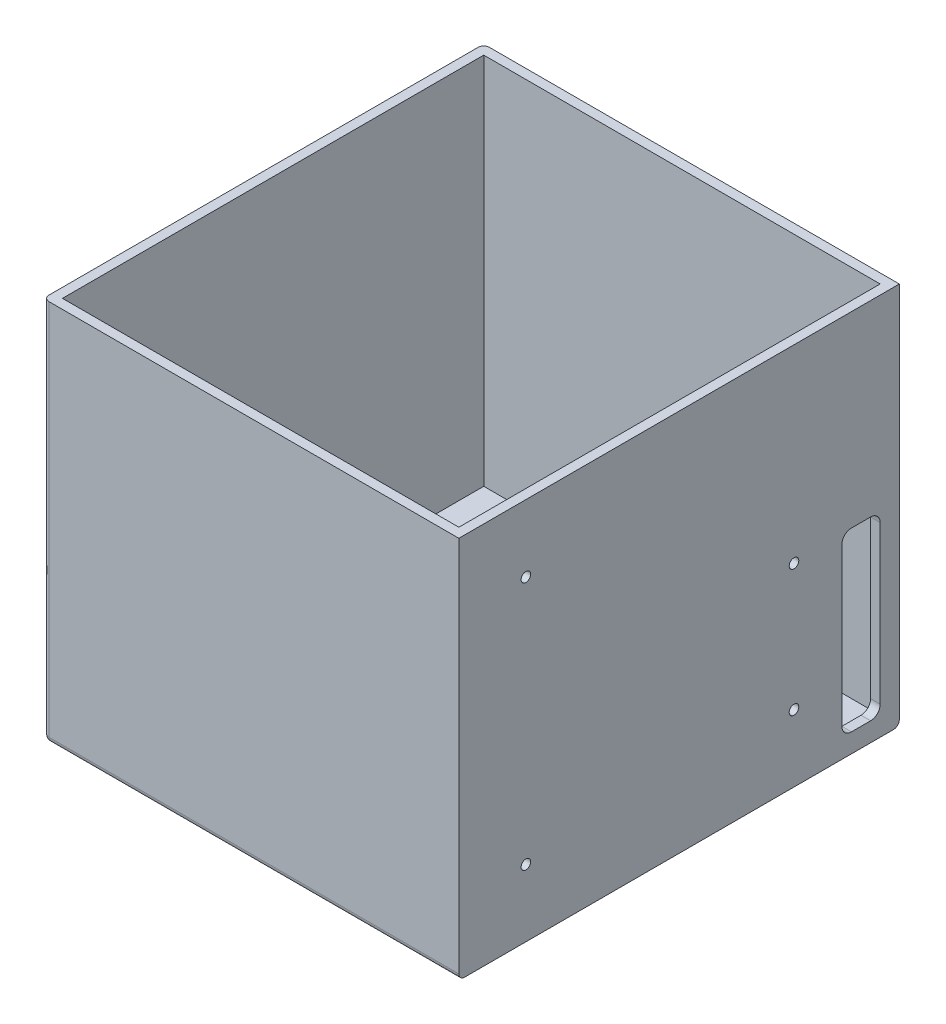
ISO-10303-21;
HEADER;
FILE_DESCRIPTION(('STEP AP214'),'2;1');
FILE_NAME('part.step','',(''),(''),'','','');
FILE_SCHEMA(('AUTOMOTIVE_DESIGN { 1 0 10303 214 1 1 1 1 }'));
ENDSEC;
DATA;
#1=APPLICATION_CONTEXT('core data for automotive mechanical design processes');
#2=APPLICATION_PROTOCOL_DEFINITION('international standard','automotive_design',2000,#1);
#3=PRODUCT_CONTEXT('',#1,'mechanical');
#4=PRODUCT('Part','Part','',(#3));
#5=PRODUCT_RELATED_PRODUCT_CATEGORY('part','',(#4));
#6=PRODUCT_DEFINITION_FORMATION('','',#4);
#7=PRODUCT_DEFINITION_CONTEXT('part definition',#1,'design');
#8=PRODUCT_DEFINITION('design','',#6,#7);
#9=PRODUCT_DEFINITION_SHAPE('','',#8);
#10=(LENGTH_UNIT() NAMED_UNIT(*) SI_UNIT(.MILLI.,.METRE.));
#11=(NAMED_UNIT(*) PLANE_ANGLE_UNIT() SI_UNIT($,.RADIAN.));
#12=(NAMED_UNIT(*) SI_UNIT($,.STERADIAN.) SOLID_ANGLE_UNIT());
#13=UNCERTAINTY_MEASURE_WITH_UNIT(LENGTH_MEASURE(1.E-05),#10,'distance_accuracy_value','');
#14=(GEOMETRIC_REPRESENTATION_CONTEXT(3) GLOBAL_UNCERTAINTY_ASSIGNED_CONTEXT((#13)) GLOBAL_UNIT_ASSIGNED_CONTEXT((#10,
#11,#12)) REPRESENTATION_CONTEXT('',''));
#15=CARTESIAN_POINT('',(0.,0.,0.));
#16=DIRECTION('',(0.,0.,1.));
#17=DIRECTION('',(1.,0.,0.));
#18=AXIS2_PLACEMENT_3D('',#15,#16,#17);
#19=CARTESIAN_POINT('',(117.297297297297,200.,-89.7324324324324));
#20=DIRECTION('',(-1.,0.,0.));
#21=DIRECTION('',(0.,0.,1.));
#22=AXIS2_PLACEMENT_3D('',#19,#20,#21);
#23=PLANE('',#22);
#24=DIRECTION('',(0.,-1.,0.));
#25=VECTOR('',#24,1.);
#26=CARTESIAN_POINT('',(117.297297297297,200.,140.267567567568));
#27=LINE('',#26,#25);
#28=CARTESIAN_POINT('',(117.297297297297,200.,140.267567567568));
#29=VERTEX_POINT('',#28);
#30=CARTESIAN_POINT('',(117.297297297297,3.,140.267567567568));
#31=VERTEX_POINT('',#30);
#32=EDGE_CURVE('E303',#29,#31,#27,.T.);
#33=ORIENTED_EDGE('',*,*,#32,.T.);
#34=CARTESIAN_POINT('',(117.297297297297,3.,137.267567567568));
#35=DIRECTION('',(-1.,0.,0.));
#36=DIRECTION('',(0.,0.,1.));
#37=AXIS2_PLACEMENT_3D('',#34,#35,#36);
#38=CIRCLE('',#37,3.);
#39=CARTESIAN_POINT('',(117.297297297297,0.,137.267567567568));
#40=VERTEX_POINT('',#39);
#41=EDGE_CURVE('E313',#31,#40,#38,.F.);
#42=ORIENTED_EDGE('',*,*,#41,.T.);
#43=DIRECTION('',(0.,0.,-1.));
#44=VECTOR('',#43,1.);
#45=CARTESIAN_POINT('',(117.297297297297,0.,-89.7324324324324));
#46=LINE('',#45,#44);
#47=CARTESIAN_POINT('',(117.297297297297,0.,-86.7324324324324));
#48=VERTEX_POINT('',#47);
#49=EDGE_CURVE('E281',#40,#48,#46,.T.);
#50=ORIENTED_EDGE('',*,*,#49,.T.);
#51=CARTESIAN_POINT('',(117.297297297297,3.,-86.7324324324324));
#52=DIRECTION('',(-1.,0.,0.));
#53=DIRECTION('',(0.,0.,1.));
#54=AXIS2_PLACEMENT_3D('',#51,#52,#53);
#55=CIRCLE('',#54,3.);
#56=CARTESIAN_POINT('',(117.297297297297,3.,-89.7324324324324));
#57=VERTEX_POINT('',#56);
#58=EDGE_CURVE('E311',#48,#57,#55,.F.);
#59=ORIENTED_EDGE('',*,*,#58,.T.);
#60=DIRECTION('',(0.,-1.,0.));
#61=VECTOR('',#60,1.);
#62=CARTESIAN_POINT('',(117.297297297297,200.,-89.7324324324324));
#63=LINE('',#62,#61);
#64=CARTESIAN_POINT('',(117.297297297297,200.,-89.7324324324324));
#65=VERTEX_POINT('',#64);
#66=EDGE_CURVE('E298',#65,#57,#63,.T.);
#67=ORIENTED_EDGE('',*,*,#66,.F.);
#68=DIRECTION('',(0.,0.,-1.));
#69=VECTOR('',#68,1.);
#70=CARTESIAN_POINT('',(117.297297297297,200.,-89.7324324324324));
#71=LINE('',#70,#69);
#72=EDGE_CURVE('E293',#29,#65,#71,.T.);
#73=ORIENTED_EDGE('',*,*,#72,.F.);
#74=EDGE_LOOP('',(#33,#42,#50,#59,#67,#73));
#75=FACE_BOUND('',#74,.T.);
#76=CARTESIAN_POINT('',(117.297297297297,35.,105.267567567568));
#77=DIRECTION('',(1.,0.,0.));
#78=DIRECTION('',(0.,0.,-1.));
#79=AXIS2_PLACEMENT_3D('',#76,#77,#78);
#80=CIRCLE('',#79,2.5);
#81=CARTESIAN_POINT('',(117.297297297297,35.,102.767567567568));
#82=VERTEX_POINT('',#81);
#83=EDGE_CURVE('E249',#82,#82,#80,.T.);
#84=ORIENTED_EDGE('',*,*,#83,.F.);
#85=EDGE_LOOP('',(#84));
#86=FACE_BOUND('',#85,.T.);
#87=CARTESIAN_POINT('',(117.297297297297,35.,-34.7324324324324));
#88=DIRECTION('',(1.,0.,0.));
#89=DIRECTION('',(0.,0.,-1.));
#90=AXIS2_PLACEMENT_3D('',#87,#88,#89);
#91=CIRCLE('',#90,2.5);
#92=CARTESIAN_POINT('',(117.297297297297,35.,-37.2324324324324));
#93=VERTEX_POINT('',#92);
#94=EDGE_CURVE('E243',#93,#93,#91,.T.);
#95=ORIENTED_EDGE('',*,*,#94,.F.);
#96=EDGE_LOOP('',(#95));
#97=FACE_BOUND('',#96,.T.);
#98=CARTESIAN_POINT('',(117.297297297297,101.184831324001,-34.7324324324324));
#99=DIRECTION('',(1.,0.,0.));
#100=DIRECTION('',(0.,0.,-1.));
#101=AXIS2_PLACEMENT_3D('',#98,#99,#100);
#102=CIRCLE('',#101,2.5);
#103=CARTESIAN_POINT('',(117.297297297297,101.184831324001,-37.2324324324324));
#104=VERTEX_POINT('',#103);
#105=EDGE_CURVE('E237',#104,#104,#102,.T.);
#106=ORIENTED_EDGE('',*,*,#105,.F.);
#107=EDGE_LOOP('',(#106));
#108=FACE_BOUND('',#107,.T.);
#109=CARTESIAN_POINT('',(117.297297297297,165.,105.267567567568));
#110=DIRECTION('',(1.,0.,0.));
#111=DIRECTION('',(0.,0.,-1.));
#112=AXIS2_PLACEMENT_3D('',#109,#110,#111);
#113=CIRCLE('',#112,2.5);
#114=CARTESIAN_POINT('',(117.297297297297,165.,102.767567567568));
#115=VERTEX_POINT('',#114);
#116=EDGE_CURVE('E234',#115,#115,#113,.T.);
#117=ORIENTED_EDGE('',*,*,#116,.F.);
#118=EDGE_LOOP('',(#117));
#119=FACE_BOUND('',#118,.T.);
#120=DIRECTION('',(0.,0.,-1.));
#121=VECTOR('',#120,1.);
#122=CARTESIAN_POINT('',(117.297297297297,102.133518404401,0.));
#123=LINE('',#122,#121);
#124=CARTESIAN_POINT('',(117.297297297297,102.133518404401,-64.7324324324325));
#125=VERTEX_POINT('',#124);
#126=CARTESIAN_POINT('',(117.297297297297,102.133518404401,-74.7324324324324));
#127=VERTEX_POINT('',#126);
#128=EDGE_CURVE('E61',#125,#127,#123,.T.);
#129=ORIENTED_EDGE('',*,*,#128,.T.);
#130=CARTESIAN_POINT('',(117.297297297297,97.1335184044014,-74.7324324324324));
#131=DIRECTION('',(1.,0.,0.));
#132=DIRECTION('',(0.,0.,-1.));
#133=AXIS2_PLACEMENT_3D('',#130,#131,#132);
#134=CIRCLE('',#133,5.);
#135=CARTESIAN_POINT('',(117.297297297297,97.1335184044014,-79.7324324324324));
#136=VERTEX_POINT('',#135);
#137=EDGE_CURVE('E214',#127,#136,#134,.F.);
#138=ORIENTED_EDGE('',*,*,#137,.T.);
#139=DIRECTION('',(0.,-1.,0.));
#140=VECTOR('',#139,1.);
#141=CARTESIAN_POINT('',(117.297297297297,0.,-79.7324324324324));
#142=LINE('',#141,#140);
#143=CARTESIAN_POINT('',(117.297297297297,14.966834817308,-79.7324324324324));
#144=VERTEX_POINT('',#143);
#145=EDGE_CURVE('E211',#136,#144,#142,.T.);
#146=ORIENTED_EDGE('',*,*,#145,.T.);
#147=CARTESIAN_POINT('',(117.297297297297,14.966834817308,-74.7324324324324));
#148=DIRECTION('',(1.,0.,0.));
#149=DIRECTION('',(0.,0.,-1.));
#150=AXIS2_PLACEMENT_3D('',#147,#148,#149);
#151=CIRCLE('',#150,4.99999999999999);
#152=CARTESIAN_POINT('',(117.297297297297,9.96683481730805,-74.7324324324324));
#153=VERTEX_POINT('',#152);
#154=EDGE_CURVE('E208',#153,#144,#151,.T.);
#155=ORIENTED_EDGE('',*,*,#154,.F.);
#156=DIRECTION('',(0.,0.,-1.));
#157=VECTOR('',#156,1.);
#158=CARTESIAN_POINT('',(117.297297297297,9.96683481730805,0.));
#159=LINE('',#158,#157);
#160=CARTESIAN_POINT('',(117.297297297297,9.96683481730805,-64.7324324324325));
#161=VERTEX_POINT('',#160);
#162=EDGE_CURVE('E202',#161,#153,#159,.T.);
#163=ORIENTED_EDGE('',*,*,#162,.F.);
#164=CARTESIAN_POINT('',(117.297297297297,14.966834817308,-64.7324324324325));
#165=DIRECTION('',(1.,0.,0.));
#166=DIRECTION('',(0.,0.,-1.));
#167=AXIS2_PLACEMENT_3D('',#164,#165,#166);
#168=CIRCLE('',#167,5.00000000000001);
#169=CARTESIAN_POINT('',(117.297297297297,14.966834817308,-59.7324324324325));
#170=VERTEX_POINT('',#169);
#171=EDGE_CURVE('E200',#170,#161,#168,.T.);
#172=ORIENTED_EDGE('',*,*,#171,.F.);
#173=DIRECTION('',(0.,-1.,0.));
#174=VECTOR('',#173,1.);
#175=CARTESIAN_POINT('',(117.297297297297,0.,-59.7324324324325));
#176=LINE('',#175,#174);
#177=CARTESIAN_POINT('',(117.297297297297,97.1335184044014,-59.7324324324325));
#178=VERTEX_POINT('',#177);
#179=EDGE_CURVE('E185',#178,#170,#176,.T.);
#180=ORIENTED_EDGE('',*,*,#179,.F.);
#181=CARTESIAN_POINT('',(117.297297297297,97.1335184044014,-64.7324324324325));
#182=DIRECTION('',(1.,0.,0.));
#183=DIRECTION('',(0.,0.,-1.));
#184=AXIS2_PLACEMENT_3D('',#181,#182,#183);
#185=CIRCLE('',#184,5.);
#186=EDGE_CURVE('E194',#125,#178,#185,.T.);
#187=ORIENTED_EDGE('',*,*,#186,.F.);
#188=EDGE_LOOP('',(#129,#138,#146,#155,#163,#172,#180,#187));
#189=FACE_BOUND('',#188,.T.);
#190=ADVANCED_FACE('F46',(#75,#86,#97,#108,#119,#189),#23,.F.);
#191=CARTESIAN_POINT('',(112.297297297297,5.,135.267567567568));
#192=DIRECTION('',(1.,0.,0.));
#193=DIRECTION('',(0.,0.,-1.));
#194=AXIS2_PLACEMENT_3D('',#191,#192,#193);
#195=PLANE('',#194);
#196=DIRECTION('',(0.,0.,-1.));
#197=VECTOR('',#196,1.);
#198=CARTESIAN_POINT('',(112.297297297297,200.,135.267567567568));
#199=LINE('',#198,#197);
#200=CARTESIAN_POINT('',(112.297297297297,200.,135.267567567568));
#201=VERTEX_POINT('',#200);
#202=CARTESIAN_POINT('',(112.297297297297,200.,-84.7324324324324));
#203=VERTEX_POINT('',#202);
#204=EDGE_CURVE('E258',#201,#203,#199,.T.);
#205=ORIENTED_EDGE('',*,*,#204,.T.);
#206=DIRECTION('',(0.,1.,0.));
#207=VECTOR('',#206,1.);
#208=CARTESIAN_POINT('',(112.297297297297,5.,-84.7324324324324));
#209=LINE('',#208,#207);
#210=CARTESIAN_POINT('',(112.297297297297,5.,-84.7324324324324));
#211=VERTEX_POINT('',#210);
#212=EDGE_CURVE('E279',#211,#203,#209,.T.);
#213=ORIENTED_EDGE('',*,*,#212,.F.);
#214=DIRECTION('',(0.,0.,-1.));
#215=VECTOR('',#214,1.);
#216=CARTESIAN_POINT('',(112.297297297297,5.,135.267567567568));
#217=LINE('',#216,#215);
#218=CARTESIAN_POINT('',(112.297297297297,5.,135.267567567568));
#219=VERTEX_POINT('',#218);
#220=EDGE_CURVE('E264',#219,#211,#217,.T.);
#221=ORIENTED_EDGE('',*,*,#220,.F.);
#222=DIRECTION('',(0.,1.,0.));
#223=VECTOR('',#222,1.);
#224=CARTESIAN_POINT('',(112.297297297297,5.,135.267567567568));
#225=LINE('',#224,#223);
#226=EDGE_CURVE('E282',#219,#201,#225,.T.);
#227=ORIENTED_EDGE('',*,*,#226,.T.);
#228=EDGE_LOOP('',(#205,#213,#221,#227));
#229=FACE_BOUND('',#228,.T.);
#230=CARTESIAN_POINT('',(112.297297297297,35.,105.267567567568));
#231=DIRECTION('',(1.,0.,0.));
#232=DIRECTION('',(0.,0.,-1.));
#233=AXIS2_PLACEMENT_3D('',#230,#231,#232);
#234=CIRCLE('',#233,2.5);
#235=CARTESIAN_POINT('',(112.297297297297,35.,102.767567567568));
#236=VERTEX_POINT('',#235);
#237=EDGE_CURVE('E219',#236,#236,#234,.T.);
#238=ORIENTED_EDGE('',*,*,#237,.T.);
#239=EDGE_LOOP('',(#238));
#240=FACE_BOUND('',#239,.T.);
#241=CARTESIAN_POINT('',(112.297297297297,35.,-34.7324324324324));
#242=DIRECTION('',(1.,0.,0.));
#243=DIRECTION('',(0.,0.,-1.));
#244=AXIS2_PLACEMENT_3D('',#241,#242,#243);
#245=CIRCLE('',#244,2.5);
#246=CARTESIAN_POINT('',(112.297297297297,35.,-37.2324324324324));
#247=VERTEX_POINT('',#246);
#248=EDGE_CURVE('E246',#247,#247,#245,.T.);
#249=ORIENTED_EDGE('',*,*,#248,.T.);
#250=EDGE_LOOP('',(#249));
#251=FACE_BOUND('',#250,.T.);
#252=CARTESIAN_POINT('',(112.297297297297,101.184831324001,-34.7324324324324));
#253=DIRECTION('',(1.,0.,0.));
#254=DIRECTION('',(0.,0.,-1.));
#255=AXIS2_PLACEMENT_3D('',#252,#253,#254);
#256=CIRCLE('',#255,2.5);
#257=CARTESIAN_POINT('',(112.297297297297,101.184831324001,-37.2324324324324));
#258=VERTEX_POINT('',#257);
#259=EDGE_CURVE('E240',#258,#258,#256,.T.);
#260=ORIENTED_EDGE('',*,*,#259,.T.);
#261=EDGE_LOOP('',(#260));
#262=FACE_BOUND('',#261,.T.);
#263=CARTESIAN_POINT('',(112.297297297297,165.,105.267567567568));
#264=DIRECTION('',(1.,0.,0.));
#265=DIRECTION('',(0.,0.,-1.));
#266=AXIS2_PLACEMENT_3D('',#263,#264,#265);
#267=CIRCLE('',#266,2.5);
#268=CARTESIAN_POINT('',(112.297297297297,165.,102.767567567568));
#269=VERTEX_POINT('',#268);
#270=EDGE_CURVE('E230',#269,#269,#267,.T.);
#271=ORIENTED_EDGE('',*,*,#270,.T.);
#272=EDGE_LOOP('',(#271));
#273=FACE_BOUND('',#272,.T.);
#274=DIRECTION('',(0.,0.,-1.));
#275=VECTOR('',#274,1.);
#276=CARTESIAN_POINT('',(112.297297297297,102.133518404401,135.267567567568));
#277=LINE('',#276,#275);
#278=CARTESIAN_POINT('',(112.297297297297,102.133518404401,-64.7324324324325));
#279=VERTEX_POINT('',#278);
#280=CARTESIAN_POINT('',(112.297297297297,102.133518404401,-74.7324324324324));
#281=VERTEX_POINT('',#280);
#282=EDGE_CURVE('E12',#279,#281,#277,.T.);
#283=ORIENTED_EDGE('',*,*,#282,.F.);
#284=CARTESIAN_POINT('',(112.297297297297,97.1335184044014,-64.7324324324325));
#285=DIRECTION('',(1.,0.,0.));
#286=DIRECTION('',(0.,0.,-1.));
#287=AXIS2_PLACEMENT_3D('',#284,#285,#286);
#288=CIRCLE('',#287,5.);
#289=CARTESIAN_POINT('',(112.297297297297,97.1335184044014,-59.7324324324325));
#290=VERTEX_POINT('',#289);
#291=EDGE_CURVE('E335',#279,#290,#288,.T.);
#292=ORIENTED_EDGE('',*,*,#291,.T.);
#293=DIRECTION('',(0.,-1.,0.));
#294=VECTOR('',#293,1.);
#295=CARTESIAN_POINT('',(112.297297297297,5.,-59.7324324324325));
#296=LINE('',#295,#294);
#297=CARTESIAN_POINT('',(112.297297297297,14.966834817308,-59.7324324324325));
#298=VERTEX_POINT('',#297);
#299=EDGE_CURVE('E188',#290,#298,#296,.T.);
#300=ORIENTED_EDGE('',*,*,#299,.T.);
#301=CARTESIAN_POINT('',(112.297297297297,14.966834817308,-64.7324324324325));
#302=DIRECTION('',(1.,0.,0.));
#303=DIRECTION('',(0.,0.,-1.));
#304=AXIS2_PLACEMENT_3D('',#301,#302,#303);
#305=CIRCLE('',#304,5.00000000000001);
#306=CARTESIAN_POINT('',(112.297297297297,9.96683481730805,-64.7324324324325));
#307=VERTEX_POINT('',#306);
#308=EDGE_CURVE('E354',#298,#307,#305,.T.);
#309=ORIENTED_EDGE('',*,*,#308,.T.);
#310=DIRECTION('',(0.,0.,-1.));
#311=VECTOR('',#310,1.);
#312=CARTESIAN_POINT('',(112.297297297297,9.96683481730805,135.267567567568));
#313=LINE('',#312,#311);
#314=CARTESIAN_POINT('',(112.297297297297,9.96683481730805,-74.7324324324324));
#315=VERTEX_POINT('',#314);
#316=EDGE_CURVE('E357',#307,#315,#313,.T.);
#317=ORIENTED_EDGE('',*,*,#316,.T.);
#318=CARTESIAN_POINT('',(112.297297297297,14.966834817308,-74.7324324324324));
#319=DIRECTION('',(1.,0.,0.));
#320=DIRECTION('',(0.,0.,-1.));
#321=AXIS2_PLACEMENT_3D('',#318,#319,#320);
#322=CIRCLE('',#321,4.99999999999999);
#323=CARTESIAN_POINT('',(112.297297297297,14.966834817308,-79.7324324324324));
#324=VERTEX_POINT('',#323);
#325=EDGE_CURVE('E360',#315,#324,#322,.T.);
#326=ORIENTED_EDGE('',*,*,#325,.T.);
#327=DIRECTION('',(0.,-1.,0.));
#328=VECTOR('',#327,1.);
#329=CARTESIAN_POINT('',(112.297297297297,5.,-79.7324324324324));
#330=LINE('',#329,#328);
#331=CARTESIAN_POINT('',(112.297297297297,97.1335184044014,-79.7324324324324));
#332=VERTEX_POINT('',#331);
#333=EDGE_CURVE('E363',#332,#324,#330,.T.);
#334=ORIENTED_EDGE('',*,*,#333,.F.);
#335=CARTESIAN_POINT('',(112.297297297297,97.1335184044014,-74.7324324324324));
#336=DIRECTION('',(1.,0.,0.));
#337=DIRECTION('',(0.,0.,-1.));
#338=AXIS2_PLACEMENT_3D('',#335,#336,#337);
#339=CIRCLE('',#338,5.);
#340=EDGE_CURVE('E54',#281,#332,#339,.F.);
#341=ORIENTED_EDGE('',*,*,#340,.F.);
#342=EDGE_LOOP('',(#283,#292,#300,#309,#317,#326,#334,#341));
#343=FACE_BOUND('',#342,.T.);
#344=ADVANCED_FACE('F377',(#229,#240,#251,#262,#273,#343),#195,.F.);
#345=CARTESIAN_POINT('',(-99.7027027027027,200.,-89.7324324324324));
#346=DIRECTION('',(1.,0.,0.));
#347=DIRECTION('',(0.,0.,-1.));
#348=AXIS2_PLACEMENT_3D('',#345,#346,#347);
#349=PLANE('',#348);
#350=DIRECTION('',(0.,0.,1.));
#351=VECTOR('',#350,1.);
#352=CARTESIAN_POINT('',(-99.7027027027027,3.,-89.7324324324324));
#353=LINE('',#352,#351);
#354=CARTESIAN_POINT('',(-99.7027027027027,3.,-86.7324324324324));
#355=VERTEX_POINT('',#354);
#356=CARTESIAN_POINT('',(-99.7027027027026,3.,137.267567567568));
#357=VERTEX_POINT('',#356);
#358=EDGE_CURVE('E327',#355,#357,#353,.T.);
#359=ORIENTED_EDGE('',*,*,#358,.T.);
#360=DIRECTION('',(0.,-1.,0.));
#361=VECTOR('',#360,1.);
#362=CARTESIAN_POINT('',(-99.7027027027026,200.,137.267567567568));
#363=LINE('',#362,#361);
#364=CARTESIAN_POINT('',(-99.7027027027026,200.,137.267567567568));
#365=VERTEX_POINT('',#364);
#366=EDGE_CURVE('E329',#357,#365,#363,.F.);
#367=ORIENTED_EDGE('',*,*,#366,.T.);
#368=DIRECTION('',(0.,0.,1.));
#369=VECTOR('',#368,1.);
#370=CARTESIAN_POINT('',(-99.7027027027027,200.,-89.7324324324324));
#371=LINE('',#370,#369);
#372=CARTESIAN_POINT('',(-99.7027027027027,200.,-86.7324324324324));
#373=VERTEX_POINT('',#372);
#374=EDGE_CURVE('E288',#373,#365,#371,.T.);
#375=ORIENTED_EDGE('',*,*,#374,.F.);
#376=DIRECTION('',(0.,-1.,0.));
#377=VECTOR('',#376,1.);
#378=CARTESIAN_POINT('',(-99.7027027027027,200.,-86.7324324324324));
#379=LINE('',#378,#377);
#380=EDGE_CURVE('E325',#373,#355,#379,.T.);
#381=ORIENTED_EDGE('',*,*,#380,.T.);
#382=EDGE_LOOP('',(#359,#367,#375,#381));
#383=FACE_BOUND('',#382,.T.);
#384=ADVANCED_FACE('F408',(#383),#349,.F.);
#385=CARTESIAN_POINT('',(-99.7027027027026,200.,140.267567567568));
#386=DIRECTION('',(0.,0.,-1.));
#387=DIRECTION('',(-1.,0.,0.));
#388=AXIS2_PLACEMENT_3D('',#385,#386,#387);
#389=PLANE('',#388);
#390=DIRECTION('',(0.,-1.,0.));
#391=VECTOR('',#390,1.);
#392=CARTESIAN_POINT('',(-96.7027027027026,200.,140.267567567568));
#393=LINE('',#392,#391);
#394=CARTESIAN_POINT('',(-96.7027027027026,200.,140.267567567568));
#395=VERTEX_POINT('',#394);
#396=CARTESIAN_POINT('',(-96.7027027027026,3.,140.267567567568));
#397=VERTEX_POINT('',#396);
#398=EDGE_CURVE('E306',#395,#397,#393,.T.);
#399=ORIENTED_EDGE('',*,*,#398,.T.);
#400=DIRECTION('',(1.,0.,0.));
#401=VECTOR('',#400,1.);
#402=CARTESIAN_POINT('',(-99.7027027027026,3.,140.267567567568));
#403=LINE('',#402,#401);
#404=EDGE_CURVE('E308',#397,#31,#403,.T.);
#405=ORIENTED_EDGE('',*,*,#404,.T.);
#406=ORIENTED_EDGE('',*,*,#32,.F.);
#407=DIRECTION('',(1.,0.,0.));
#408=VECTOR('',#407,1.);
#409=CARTESIAN_POINT('',(-99.7027027027026,200.,140.267567567568));
#410=LINE('',#409,#408);
#411=EDGE_CURVE('E291',#395,#29,#410,.T.);
#412=ORIENTED_EDGE('',*,*,#411,.F.);
#413=EDGE_LOOP('',(#399,#405,#406,#412));
#414=FACE_BOUND('',#413,.T.);
#415=ADVANCED_FACE('F416',(#414),#389,.F.);
#416=CARTESIAN_POINT('',(-99.7027027027027,200.,-89.7324324324324));
#417=DIRECTION('',(0.,0.,1.));
#418=DIRECTION('',(1.,0.,0.));
#419=AXIS2_PLACEMENT_3D('',#416,#417,#418);
#420=PLANE('',#419);
#421=ORIENTED_EDGE('',*,*,#66,.T.);
#422=DIRECTION('',(-1.,0.,0.));
#423=VECTOR('',#422,1.);
#424=CARTESIAN_POINT('',(-99.7027027027027,3.,-89.7324324324324));
#425=LINE('',#424,#423);
#426=CARTESIAN_POINT('',(-96.7027027027027,3.,-89.7324324324324));
#427=VERTEX_POINT('',#426);
#428=EDGE_CURVE('E323',#57,#427,#425,.T.);
#429=ORIENTED_EDGE('',*,*,#428,.T.);
#430=DIRECTION('',(0.,-1.,0.));
#431=VECTOR('',#430,1.);
#432=CARTESIAN_POINT('',(-96.7027027027027,200.,-89.7324324324324));
#433=LINE('',#432,#431);
#434=CARTESIAN_POINT('',(-96.7027027027027,200.,-89.7324324324324));
#435=VERTEX_POINT('',#434);
#436=EDGE_CURVE('E321',#427,#435,#433,.F.);
#437=ORIENTED_EDGE('',*,*,#436,.T.);
#438=DIRECTION('',(-1.,0.,0.));
#439=VECTOR('',#438,1.);
#440=CARTESIAN_POINT('',(-99.7027027027027,200.,-89.7324324324324));
#441=LINE('',#440,#439);
#442=EDGE_CURVE('E295',#65,#435,#441,.T.);
#443=ORIENTED_EDGE('',*,*,#442,.F.);
#444=EDGE_LOOP('',(#421,#429,#437,#443));
#445=FACE_BOUND('',#444,.T.);
#446=ADVANCED_FACE('F414',(#445),#420,.F.);
#447=CARTESIAN_POINT('',(0.,200.,0.));
#448=DIRECTION('',(0.,1.,0.));
#449=DIRECTION('',(0.,0.,1.));
#450=AXIS2_PLACEMENT_3D('',#447,#448,#449);
#451=PLANE('',#450);
#452=DIRECTION('',(-1.,0.,0.));
#453=VECTOR('',#452,1.);
#454=CARTESIAN_POINT('',(112.297297297297,200.,-84.7324324324324));
#455=LINE('',#454,#453);
#456=CARTESIAN_POINT('',(-94.7027027027027,200.,-84.7324324324324));
#457=VERTEX_POINT('',#456);
#458=EDGE_CURVE('E268',#203,#457,#455,.T.);
#459=ORIENTED_EDGE('',*,*,#458,.F.);
#460=ORIENTED_EDGE('',*,*,#204,.F.);
#461=DIRECTION('',(1.,0.,0.));
#462=VECTOR('',#461,1.);
#463=CARTESIAN_POINT('',(-94.7027027027026,200.,135.267567567568));
#464=LINE('',#463,#462);
#465=CARTESIAN_POINT('',(-94.7027027027026,200.,135.267567567568));
#466=VERTEX_POINT('',#465);
#467=EDGE_CURVE('E274',#466,#201,#464,.T.);
#468=ORIENTED_EDGE('',*,*,#467,.F.);
#469=DIRECTION('',(0.,0.,1.));
#470=VECTOR('',#469,1.);
#471=CARTESIAN_POINT('',(-94.7027027027027,200.,-84.7324324324324));
#472=LINE('',#471,#470);
#473=EDGE_CURVE('E270',#457,#466,#472,.T.);
#474=ORIENTED_EDGE('',*,*,#473,.F.);
#475=EDGE_LOOP('',(#459,#460,#468,#474));
#476=FACE_BOUND('',#475,.T.);
#477=ORIENTED_EDGE('',*,*,#374,.T.);
#478=CARTESIAN_POINT('',(-96.7027027027026,200.,137.267567567568));
#479=DIRECTION('',(0.,1.,0.));
#480=DIRECTION('',(0.,0.,1.));
#481=AXIS2_PLACEMENT_3D('',#478,#479,#480);
#482=CIRCLE('',#481,3.);
#483=EDGE_CURVE('E333',#365,#395,#482,.T.);
#484=ORIENTED_EDGE('',*,*,#483,.T.);
#485=ORIENTED_EDGE('',*,*,#411,.T.);
#486=ORIENTED_EDGE('',*,*,#72,.T.);
#487=ORIENTED_EDGE('',*,*,#442,.T.);
#488=CARTESIAN_POINT('',(-96.7027027027027,200.,-86.7324324324324));
#489=DIRECTION('',(0.,1.,0.));
#490=DIRECTION('',(0.,0.,1.));
#491=AXIS2_PLACEMENT_3D('',#488,#489,#490);
#492=CIRCLE('',#491,3.);
#493=EDGE_CURVE('E331',#435,#373,#492,.T.);
#494=ORIENTED_EDGE('',*,*,#493,.T.);
#495=EDGE_LOOP('',(#477,#484,#485,#486,#487,#494));
#496=FACE_BOUND('',#495,.T.);
#497=ADVANCED_FACE('F458',(#476,#496),#451,.T.);
#498=CARTESIAN_POINT('',(0.,0.,0.));
#499=DIRECTION('',(0.,1.,0.));
#500=DIRECTION('',(0.,0.,1.));
#501=AXIS2_PLACEMENT_3D('',#498,#499,#500);
#502=PLANE('',#501);
#503=ORIENTED_EDGE('',*,*,#49,.F.);
#504=DIRECTION('',(1.,0.,0.));
#505=VECTOR('',#504,1.);
#506=CARTESIAN_POINT('',(0.,0.,137.267567567568));
#507=LINE('',#506,#505);
#508=CARTESIAN_POINT('',(-96.7027027027026,0.,137.267567567568));
#509=VERTEX_POINT('',#508);
#510=EDGE_CURVE('E319',#40,#509,#507,.F.);
#511=ORIENTED_EDGE('',*,*,#510,.T.);
#512=DIRECTION('',(0.,0.,1.));
#513=VECTOR('',#512,1.);
#514=CARTESIAN_POINT('',(-96.7027027027026,0.,0.));
#515=LINE('',#514,#513);
#516=CARTESIAN_POINT('',(-96.7027027027027,0.,-86.7324324324324));
#517=VERTEX_POINT('',#516);
#518=EDGE_CURVE('E315',#509,#517,#515,.F.);
#519=ORIENTED_EDGE('',*,*,#518,.T.);
#520=DIRECTION('',(-1.,0.,0.));
#521=VECTOR('',#520,1.);
#522=CARTESIAN_POINT('',(0.,0.,-86.7324324324324));
#523=LINE('',#522,#521);
#524=EDGE_CURVE('E317',#517,#48,#523,.F.);
#525=ORIENTED_EDGE('',*,*,#524,.T.);
#526=EDGE_LOOP('',(#503,#511,#519,#525));
#527=FACE_BOUND('',#526,.T.);
#528=ADVANCED_FACE('F481',(#527),#502,.F.);
#529=CARTESIAN_POINT('',(112.297297297297,5.,-84.7324324324324));
#530=DIRECTION('',(0.,0.,-1.));
#531=DIRECTION('',(-1.,0.,0.));
#532=AXIS2_PLACEMENT_3D('',#529,#530,#531);
#533=PLANE('',#532);
#534=ORIENTED_EDGE('',*,*,#458,.T.);
#535=DIRECTION('',(0.,1.,0.));
#536=VECTOR('',#535,1.);
#537=CARTESIAN_POINT('',(-94.7027027027027,5.,-84.7324324324324));
#538=LINE('',#537,#536);
#539=CARTESIAN_POINT('',(-94.7027027027027,5.,-84.7324324324324));
#540=VERTEX_POINT('',#539);
#541=EDGE_CURVE('E267',#540,#457,#538,.T.);
#542=ORIENTED_EDGE('',*,*,#541,.F.);
#543=DIRECTION('',(-1.,0.,0.));
#544=VECTOR('',#543,1.);
#545=CARTESIAN_POINT('',(112.297297297297,5.,-84.7324324324324));
#546=LINE('',#545,#544);
#547=EDGE_CURVE('E254',#211,#540,#546,.T.);
#548=ORIENTED_EDGE('',*,*,#547,.F.);
#549=ORIENTED_EDGE('',*,*,#212,.T.);
#550=EDGE_LOOP('',(#534,#542,#548,#549));
#551=FACE_BOUND('',#550,.T.);
#552=ADVANCED_FACE('F483',(#551),#533,.F.);
#553=CARTESIAN_POINT('',(-94.7027027027026,5.,135.267567567568));
#554=DIRECTION('',(0.,0.,1.));
#555=DIRECTION('',(1.,0.,0.));
#556=AXIS2_PLACEMENT_3D('',#553,#554,#555);
#557=PLANE('',#556);
#558=ORIENTED_EDGE('',*,*,#467,.T.);
#559=ORIENTED_EDGE('',*,*,#226,.F.);
#560=DIRECTION('',(1.,0.,0.));
#561=VECTOR('',#560,1.);
#562=CARTESIAN_POINT('',(-94.7027027027026,5.,135.267567567568));
#563=LINE('',#562,#561);
#564=CARTESIAN_POINT('',(-94.7027027027026,5.,135.267567567568));
#565=VERTEX_POINT('',#564);
#566=EDGE_CURVE('E261',#565,#219,#563,.T.);
#567=ORIENTED_EDGE('',*,*,#566,.F.);
#568=DIRECTION('',(0.,1.,0.));
#569=VECTOR('',#568,1.);
#570=CARTESIAN_POINT('',(-94.7027027027026,5.,135.267567567568));
#571=LINE('',#570,#569);
#572=EDGE_CURVE('E284',#565,#466,#571,.T.);
#573=ORIENTED_EDGE('',*,*,#572,.T.);
#574=EDGE_LOOP('',(#558,#559,#567,#573));
#575=FACE_BOUND('',#574,.T.);
#576=ADVANCED_FACE('F488',(#575),#557,.F.);
#577=CARTESIAN_POINT('',(-94.7027027027027,5.,-84.7324324324324));
#578=DIRECTION('',(-1.,0.,0.));
#579=DIRECTION('',(0.,0.,1.));
#580=AXIS2_PLACEMENT_3D('',#577,#578,#579);
#581=PLANE('',#580);
#582=ORIENTED_EDGE('',*,*,#473,.T.);
#583=ORIENTED_EDGE('',*,*,#572,.F.);
#584=DIRECTION('',(0.,0.,1.));
#585=VECTOR('',#584,1.);
#586=CARTESIAN_POINT('',(-94.7027027027027,5.,-84.7324324324324));
#587=LINE('',#586,#585);
#588=EDGE_CURVE('E257',#540,#565,#587,.T.);
#589=ORIENTED_EDGE('',*,*,#588,.F.);
#590=ORIENTED_EDGE('',*,*,#541,.T.);
#591=EDGE_LOOP('',(#582,#583,#589,#590));
#592=FACE_BOUND('',#591,.T.);
#593=ADVANCED_FACE('F494',(#592),#581,.F.);
#594=CARTESIAN_POINT('',(0.,5.,0.));
#595=DIRECTION('',(0.,1.,0.));
#596=DIRECTION('',(0.,0.,1.));
#597=AXIS2_PLACEMENT_3D('',#594,#595,#596);
#598=PLANE('',#597);
#599=ORIENTED_EDGE('',*,*,#547,.T.);
#600=ORIENTED_EDGE('',*,*,#588,.T.);
#601=ORIENTED_EDGE('',*,*,#566,.T.);
#602=ORIENTED_EDGE('',*,*,#220,.T.);
#603=EDGE_LOOP('',(#599,#600,#601,#602));
#604=FACE_BOUND('',#603,.T.);
#605=ADVANCED_FACE('F449',(#604),#598,.T.);
#606=CARTESIAN_POINT('',(-99.7027027027027,3.,-86.7324324324324));
#607=DIRECTION('',(-1.,0.,0.));
#608=DIRECTION('',(0.,0.,1.));
#609=AXIS2_PLACEMENT_3D('',#606,#607,#608);
#610=CYLINDRICAL_SURFACE('',#609,3.);
#611=ORIENTED_EDGE('',*,*,#58,.F.);
#612=ORIENTED_EDGE('',*,*,#524,.F.);
#613=CARTESIAN_POINT('',(-96.7027027027027,3.,-86.7324324324324));
#614=DIRECTION('',(-1.,0.,0.));
#615=DIRECTION('',(0.,0.,1.));
#616=AXIS2_PLACEMENT_3D('',#613,#614,#615);
#617=CIRCLE('',#616,3.);
#618=EDGE_CURVE('E271',#427,#517,#617,.T.);
#619=ORIENTED_EDGE('',*,*,#618,.F.);
#620=ORIENTED_EDGE('',*,*,#428,.F.);
#621=EDGE_LOOP('',(#611,#612,#619,#620));
#622=FACE_BOUND('',#621,.T.);
#623=ADVANCED_FACE('F48',(#622),#610,.T.);
#624=CARTESIAN_POINT('',(-96.7027027027027,200.,-86.7324324324324));
#625=DIRECTION('',(0.,-1.,0.));
#626=DIRECTION('',(0.,0.,-1.));
#627=AXIS2_PLACEMENT_3D('',#624,#625,#626);
#628=CYLINDRICAL_SURFACE('',#627,3.);
#629=ORIENTED_EDGE('',*,*,#493,.F.);
#630=ORIENTED_EDGE('',*,*,#436,.F.);
#631=CARTESIAN_POINT('',(-96.7027027027027,3.,-86.7324324324324));
#632=DIRECTION('',(0.,-1.,0.));
#633=DIRECTION('',(0.,0.,-1.));
#634=AXIS2_PLACEMENT_3D('',#631,#632,#633);
#635=CIRCLE('',#634,3.);
#636=EDGE_CURVE('E347',#355,#427,#635,.T.);
#637=ORIENTED_EDGE('',*,*,#636,.F.);
#638=ORIENTED_EDGE('',*,*,#380,.F.);
#639=EDGE_LOOP('',(#629,#630,#637,#638));
#640=FACE_BOUND('',#639,.T.);
#641=ADVANCED_FACE('F442',(#640),#628,.T.);
#642=CARTESIAN_POINT('',(-96.7027027027027,3.,-86.7324324324324));
#643=DIRECTION('',(0.,0.,-1.));
#644=DIRECTION('',(0.,1.,0.));
#645=AXIS2_PLACEMENT_3D('',#642,#643,#644);
#646=SPHERICAL_SURFACE('',#645,3.);
#647=ORIENTED_EDGE('',*,*,#636,.T.);
#648=ORIENTED_EDGE('',*,*,#618,.T.);
#649=CARTESIAN_POINT('',(-96.7027027027027,3.,-86.7324324324324));
#650=DIRECTION('',(0.,0.,-1.));
#651=DIRECTION('',(-1.,0.,0.));
#652=AXIS2_PLACEMENT_3D('',#649,#650,#651);
#653=CIRCLE('',#652,3.);
#654=EDGE_CURVE('E344',#355,#517,#653,.F.);
#655=ORIENTED_EDGE('',*,*,#654,.F.);
#656=EDGE_LOOP('',(#647,#648,#655));
#657=FACE_BOUND('',#656,.T.);
#658=ADVANCED_FACE('F439',(#657),#646,.T.);
#659=CARTESIAN_POINT('',(-96.7027027027027,3.,-89.7324324324324));
#660=DIRECTION('',(0.,0.,1.));
#661=DIRECTION('',(1.,0.,0.));
#662=AXIS2_PLACEMENT_3D('',#659,#660,#661);
#663=CYLINDRICAL_SURFACE('',#662,3.);
#664=ORIENTED_EDGE('',*,*,#654,.T.);
#665=ORIENTED_EDGE('',*,*,#518,.F.);
#666=CARTESIAN_POINT('',(-96.7027027027026,3.,137.267567567568));
#667=DIRECTION('',(0.,0.,1.));
#668=DIRECTION('',(1.,0.,0.));
#669=AXIS2_PLACEMENT_3D('',#666,#667,#668);
#670=CIRCLE('',#669,3.);
#671=EDGE_CURVE('E341',#357,#509,#670,.T.);
#672=ORIENTED_EDGE('',*,*,#671,.F.);
#673=ORIENTED_EDGE('',*,*,#358,.F.);
#674=EDGE_LOOP('',(#664,#665,#672,#673));
#675=FACE_BOUND('',#674,.T.);
#676=ADVANCED_FACE('F435',(#675),#663,.T.);
#677=CARTESIAN_POINT('',(-96.7027027027026,200.,137.267567567568));
#678=DIRECTION('',(0.,-1.,0.));
#679=DIRECTION('',(0.,0.,-1.));
#680=AXIS2_PLACEMENT_3D('',#677,#678,#679);
#681=CYLINDRICAL_SURFACE('',#680,3.);
#682=ORIENTED_EDGE('',*,*,#483,.F.);
#683=ORIENTED_EDGE('',*,*,#366,.F.);
#684=CARTESIAN_POINT('',(-96.7027027027026,3.,137.267567567568));
#685=DIRECTION('',(0.,-1.,0.));
#686=DIRECTION('',(0.,0.,-1.));
#687=AXIS2_PLACEMENT_3D('',#684,#685,#686);
#688=CIRCLE('',#687,3.);
#689=EDGE_CURVE('E338',#397,#357,#688,.T.);
#690=ORIENTED_EDGE('',*,*,#689,.F.);
#691=ORIENTED_EDGE('',*,*,#398,.F.);
#692=EDGE_LOOP('',(#682,#683,#690,#691));
#693=FACE_BOUND('',#692,.T.);
#694=ADVANCED_FACE('F431',(#693),#681,.T.);
#695=CARTESIAN_POINT('',(-96.7027027027026,3.,137.267567567568));
#696=DIRECTION('',(-1.,0.,0.));
#697=DIRECTION('',(0.,-1.,0.));
#698=AXIS2_PLACEMENT_3D('',#695,#696,#697);
#699=SPHERICAL_SURFACE('',#698,3.);
#700=ORIENTED_EDGE('',*,*,#689,.T.);
#701=ORIENTED_EDGE('',*,*,#671,.T.);
#702=CARTESIAN_POINT('',(-96.7027027027026,3.,137.267567567568));
#703=DIRECTION('',(-1.,0.,0.));
#704=DIRECTION('',(0.,0.,1.));
#705=AXIS2_PLACEMENT_3D('',#702,#703,#704);
#706=CIRCLE('',#705,3.);
#707=EDGE_CURVE('E233',#397,#509,#706,.F.);
#708=ORIENTED_EDGE('',*,*,#707,.F.);
#709=EDGE_LOOP('',(#700,#701,#708));
#710=FACE_BOUND('',#709,.T.);
#711=ADVANCED_FACE('F427',(#710),#699,.T.);
#712=CARTESIAN_POINT('',(-99.7027027027026,3.,137.267567567568));
#713=DIRECTION('',(1.,0.,0.));
#714=DIRECTION('',(0.,0.,-1.));
#715=AXIS2_PLACEMENT_3D('',#712,#713,#714);
#716=CYLINDRICAL_SURFACE('',#715,3.);
#717=ORIENTED_EDGE('',*,*,#707,.T.);
#718=ORIENTED_EDGE('',*,*,#510,.F.);
#719=ORIENTED_EDGE('',*,*,#41,.F.);
#720=ORIENTED_EDGE('',*,*,#404,.F.);
#721=EDGE_LOOP('',(#717,#718,#719,#720));
#722=FACE_BOUND('',#721,.T.);
#723=ADVANCED_FACE('F423',(#722),#716,.T.);
#724=CARTESIAN_POINT('',(112.297297297297,35.,105.267567567568));
#725=DIRECTION('',(1.,0.,0.));
#726=DIRECTION('',(0.,0.,-1.));
#727=AXIS2_PLACEMENT_3D('',#724,#725,#726);
#728=CYLINDRICAL_SURFACE('',#727,2.5);
#729=ORIENTED_EDGE('',*,*,#83,.T.);
#730=EDGE_LOOP('',(#729));
#731=FACE_BOUND('',#730,.T.);
#732=ORIENTED_EDGE('',*,*,#237,.F.);
#733=EDGE_LOOP('',(#732));
#734=FACE_BOUND('',#733,.T.);
#735=ADVANCED_FACE('F426',(#731,#734),#728,.F.);
#736=CARTESIAN_POINT('',(112.297297297297,35.,-34.7324324324324));
#737=DIRECTION('',(1.,0.,0.));
#738=DIRECTION('',(0.,0.,-1.));
#739=AXIS2_PLACEMENT_3D('',#736,#737,#738);
#740=CYLINDRICAL_SURFACE('',#739,2.5);
#741=ORIENTED_EDGE('',*,*,#248,.F.);
#742=EDGE_LOOP('',(#741));
#743=FACE_BOUND('',#742,.T.);
#744=ORIENTED_EDGE('',*,*,#94,.T.);
#745=EDGE_LOOP('',(#744));
#746=FACE_BOUND('',#745,.T.);
#747=ADVANCED_FACE('F506',(#743,#746),#740,.F.);
#748=CARTESIAN_POINT('',(112.297297297297,101.184831324001,-34.7324324324324));
#749=DIRECTION('',(1.,0.,0.));
#750=DIRECTION('',(0.,0.,-1.));
#751=AXIS2_PLACEMENT_3D('',#748,#749,#750);
#752=CYLINDRICAL_SURFACE('',#751,2.5);
#753=ORIENTED_EDGE('',*,*,#259,.F.);
#754=EDGE_LOOP('',(#753));
#755=FACE_BOUND('',#754,.T.);
#756=ORIENTED_EDGE('',*,*,#105,.T.);
#757=EDGE_LOOP('',(#756));
#758=FACE_BOUND('',#757,.T.);
#759=ADVANCED_FACE('F397',(#755,#758),#752,.F.);
#760=CARTESIAN_POINT('',(112.297297297297,165.,105.267567567568));
#761=DIRECTION('',(1.,0.,0.));
#762=DIRECTION('',(0.,0.,-1.));
#763=AXIS2_PLACEMENT_3D('',#760,#761,#762);
#764=CYLINDRICAL_SURFACE('',#763,2.5);
#765=ORIENTED_EDGE('',*,*,#270,.F.);
#766=EDGE_LOOP('',(#765));
#767=FACE_BOUND('',#766,.T.);
#768=ORIENTED_EDGE('',*,*,#116,.T.);
#769=EDGE_LOOP('',(#768));
#770=FACE_BOUND('',#769,.T.);
#771=ADVANCED_FACE('F389',(#767,#770),#764,.F.);
#772=CARTESIAN_POINT('',(107.297297297297,102.133518404401,0.));
#773=DIRECTION('',(0.,-1.,0.));
#774=DIRECTION('',(0.,0.,-1.));
#775=AXIS2_PLACEMENT_3D('',#772,#773,#774);
#776=PLANE('',#775);
#777=ORIENTED_EDGE('',*,*,#282,.T.);
#778=DIRECTION('',(1.,0.,0.));
#779=VECTOR('',#778,1.);
#780=CARTESIAN_POINT('',(107.297297297297,102.133518404401,-74.7324324324324));
#781=LINE('',#780,#779);
#782=EDGE_CURVE('E217',#281,#127,#781,.T.);
#783=ORIENTED_EDGE('',*,*,#782,.T.);
#784=ORIENTED_EDGE('',*,*,#128,.F.);
#785=DIRECTION('',(1.,0.,0.));
#786=VECTOR('',#785,1.);
#787=CARTESIAN_POINT('',(107.297297297297,102.133518404401,-64.7324324324325));
#788=LINE('',#787,#786);
#789=EDGE_CURVE('E191',#279,#125,#788,.T.);
#790=ORIENTED_EDGE('',*,*,#789,.F.);
#791=EDGE_LOOP('',(#777,#783,#784,#790));
#792=FACE_BOUND('',#791,.T.);
#793=ADVANCED_FACE('F387',(#792),#776,.T.);
#794=CARTESIAN_POINT('',(107.297297297297,97.1335184044014,-74.7324324324324));
#795=DIRECTION('',(1.,0.,0.));
#796=DIRECTION('',(0.,0.,-1.));
#797=AXIS2_PLACEMENT_3D('',#794,#795,#796);
#798=CYLINDRICAL_SURFACE('',#797,5.);
#799=ORIENTED_EDGE('',*,*,#340,.T.);
#800=DIRECTION('',(1.,0.,0.));
#801=VECTOR('',#800,1.);
#802=CARTESIAN_POINT('',(107.297297297297,97.1335184044014,-79.7324324324324));
#803=LINE('',#802,#801);
#804=EDGE_CURVE('E220',#332,#136,#803,.T.);
#805=ORIENTED_EDGE('',*,*,#804,.T.);
#806=ORIENTED_EDGE('',*,*,#137,.F.);
#807=ORIENTED_EDGE('',*,*,#782,.F.);
#808=EDGE_LOOP('',(#799,#805,#806,#807));
#809=FACE_BOUND('',#808,.T.);
#810=ADVANCED_FACE('F368',(#809),#798,.F.);
#811=CARTESIAN_POINT('',(107.297297297297,0.,-79.7324324324324));
#812=DIRECTION('',(0.,0.,1.));
#813=DIRECTION('',(1.,0.,0.));
#814=AXIS2_PLACEMENT_3D('',#811,#812,#813);
#815=PLANE('',#814);
#816=ORIENTED_EDGE('',*,*,#333,.T.);
#817=DIRECTION('',(1.,0.,0.));
#818=VECTOR('',#817,1.);
#819=CARTESIAN_POINT('',(107.297297297297,14.966834817308,-79.7324324324324));
#820=LINE('',#819,#818);
#821=EDGE_CURVE('E222',#324,#144,#820,.T.);
#822=ORIENTED_EDGE('',*,*,#821,.T.);
#823=ORIENTED_EDGE('',*,*,#145,.F.);
#824=ORIENTED_EDGE('',*,*,#804,.F.);
#825=EDGE_LOOP('',(#816,#822,#823,#824));
#826=FACE_BOUND('',#825,.T.);
#827=ADVANCED_FACE('F375',(#826),#815,.T.);
#828=CARTESIAN_POINT('',(107.297297297297,14.966834817308,-74.7324324324324));
#829=DIRECTION('',(1.,0.,0.));
#830=DIRECTION('',(0.,0.,-1.));
#831=AXIS2_PLACEMENT_3D('',#828,#829,#830);
#832=CYLINDRICAL_SURFACE('',#831,4.99999999999999);
#833=DIRECTION('',(1.,0.,0.));
#834=VECTOR('',#833,1.);
#835=CARTESIAN_POINT('',(107.297297297297,9.96683481730805,-74.7324324324324));
#836=LINE('',#835,#834);
#837=EDGE_CURVE('E224',#315,#153,#836,.T.);
#838=ORIENTED_EDGE('',*,*,#837,.T.);
#839=ORIENTED_EDGE('',*,*,#154,.T.);
#840=ORIENTED_EDGE('',*,*,#821,.F.);
#841=ORIENTED_EDGE('',*,*,#325,.F.);
#842=EDGE_LOOP('',(#838,#839,#840,#841));
#843=FACE_BOUND('',#842,.T.);
#844=ADVANCED_FACE('F380',(#843),#832,.F.);
#845=CARTESIAN_POINT('',(107.297297297297,9.96683481730805,0.));
#846=DIRECTION('',(0.,-1.,0.));
#847=DIRECTION('',(0.,0.,-1.));
#848=AXIS2_PLACEMENT_3D('',#845,#846,#847);
#849=PLANE('',#848);
#850=DIRECTION('',(1.,0.,0.));
#851=VECTOR('',#850,1.);
#852=CARTESIAN_POINT('',(107.297297297297,9.96683481730805,-64.7324324324325));
#853=LINE('',#852,#851);
#854=EDGE_CURVE('E226',#307,#161,#853,.T.);
#855=ORIENTED_EDGE('',*,*,#854,.T.);
#856=ORIENTED_EDGE('',*,*,#162,.T.);
#857=ORIENTED_EDGE('',*,*,#837,.F.);
#858=ORIENTED_EDGE('',*,*,#316,.F.);
#859=EDGE_LOOP('',(#855,#856,#857,#858));
#860=FACE_BOUND('',#859,.T.);
#861=ADVANCED_FACE('F382',(#860),#849,.F.);
#862=CARTESIAN_POINT('',(107.297297297297,14.966834817308,-64.7324324324325));
#863=DIRECTION('',(1.,0.,0.));
#864=DIRECTION('',(0.,0.,-1.));
#865=AXIS2_PLACEMENT_3D('',#862,#863,#864);
#866=CYLINDRICAL_SURFACE('',#865,5.00000000000001);
#867=DIRECTION('',(1.,0.,0.));
#868=VECTOR('',#867,1.);
#869=CARTESIAN_POINT('',(107.297297297297,14.966834817308,-59.7324324324325));
#870=LINE('',#869,#868);
#871=EDGE_CURVE('E190',#298,#170,#870,.T.);
#872=ORIENTED_EDGE('',*,*,#871,.T.);
#873=ORIENTED_EDGE('',*,*,#171,.T.);
#874=ORIENTED_EDGE('',*,*,#854,.F.);
#875=ORIENTED_EDGE('',*,*,#308,.F.);
#876=EDGE_LOOP('',(#872,#873,#874,#875));
#877=FACE_BOUND('',#876,.T.);
#878=ADVANCED_FACE('F386',(#877),#866,.F.);
#879=CARTESIAN_POINT('',(107.297297297297,0.,-59.7324324324325));
#880=DIRECTION('',(0.,0.,1.));
#881=DIRECTION('',(1.,0.,0.));
#882=AXIS2_PLACEMENT_3D('',#879,#880,#881);
#883=PLANE('',#882);
#884=DIRECTION('',(1.,0.,0.));
#885=VECTOR('',#884,1.);
#886=CARTESIAN_POINT('',(107.297297297297,97.1335184044014,-59.7324324324325));
#887=LINE('',#886,#885);
#888=EDGE_CURVE('E69',#290,#178,#887,.T.);
#889=ORIENTED_EDGE('',*,*,#888,.T.);
#890=ORIENTED_EDGE('',*,*,#179,.T.);
#891=ORIENTED_EDGE('',*,*,#871,.F.);
#892=ORIENTED_EDGE('',*,*,#299,.F.);
#893=EDGE_LOOP('',(#889,#890,#891,#892));
#894=FACE_BOUND('',#893,.T.);
#895=ADVANCED_FACE('F182',(#894),#883,.F.);
#896=CARTESIAN_POINT('',(107.297297297297,97.1335184044014,-64.7324324324325));
#897=DIRECTION('',(1.,0.,0.));
#898=DIRECTION('',(0.,0.,-1.));
#899=AXIS2_PLACEMENT_3D('',#896,#897,#898);
#900=CYLINDRICAL_SURFACE('',#899,5.);
#901=ORIENTED_EDGE('',*,*,#789,.T.);
#902=ORIENTED_EDGE('',*,*,#186,.T.);
#903=ORIENTED_EDGE('',*,*,#888,.F.);
#904=ORIENTED_EDGE('',*,*,#291,.F.);
#905=EDGE_LOOP('',(#901,#902,#903,#904));
#906=FACE_BOUND('',#905,.T.);
#907=ADVANCED_FACE('F195',(#906),#900,.F.);
#908=CLOSED_SHELL('',(#190,#344,#384,#415,#446,#497,#528,#552,#576,#593,#605,#623,#641,#658,
#676,#694,#711,#723,#735,#747,#759,#771,#793,#810,#827,#844,#861,#878,#895,#907));
#909=MANIFOLD_SOLID_BREP('B2',#908);
#910=ADVANCED_BREP_SHAPE_REPRESENTATION('',(#18,#909),#14);
#911=SHAPE_DEFINITION_REPRESENTATION(#9,#910);
ENDSEC;
END-ISO-10303-21;
